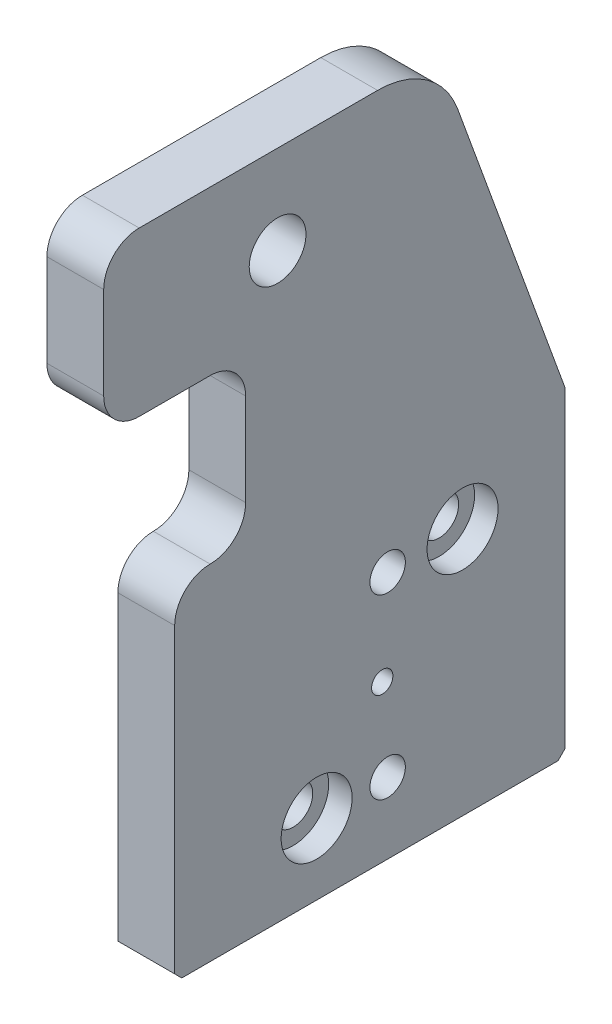
ISO-10303-21;
HEADER;
FILE_DESCRIPTION(('STEP AP214'),'2;1');
FILE_NAME('part.step','',(''),(''),'','','');
FILE_SCHEMA(('AUTOMOTIVE_DESIGN { 1 0 10303 214 1 1 1 1 }'));
ENDSEC;
DATA;
#1=APPLICATION_CONTEXT('core data for automotive mechanical design processes');
#2=APPLICATION_PROTOCOL_DEFINITION('international standard','automotive_design',2000,#1);
#3=PRODUCT_CONTEXT('',#1,'mechanical');
#4=PRODUCT('Part','Part','',(#3));
#5=PRODUCT_RELATED_PRODUCT_CATEGORY('part','',(#4));
#6=PRODUCT_DEFINITION_FORMATION('','',#4);
#7=PRODUCT_DEFINITION_CONTEXT('part definition',#1,'design');
#8=PRODUCT_DEFINITION('design','',#6,#7);
#9=PRODUCT_DEFINITION_SHAPE('','',#8);
#10=(LENGTH_UNIT() NAMED_UNIT(*) SI_UNIT(.MILLI.,.METRE.));
#11=(NAMED_UNIT(*) PLANE_ANGLE_UNIT() SI_UNIT($,.RADIAN.));
#12=(NAMED_UNIT(*) SI_UNIT($,.STERADIAN.) SOLID_ANGLE_UNIT());
#13=UNCERTAINTY_MEASURE_WITH_UNIT(LENGTH_MEASURE(1.E-05),#10,'distance_accuracy_value','');
#14=(GEOMETRIC_REPRESENTATION_CONTEXT(3) GLOBAL_UNCERTAINTY_ASSIGNED_CONTEXT((#13)) GLOBAL_UNIT_ASSIGNED_CONTEXT((#10,
#11,#12)) REPRESENTATION_CONTEXT('',''));
#15=CARTESIAN_POINT('',(0.,0.,0.));
#16=DIRECTION('',(0.,0.,1.));
#17=DIRECTION('',(1.,0.,0.));
#18=AXIS2_PLACEMENT_3D('',#15,#16,#17);
#19=CARTESIAN_POINT('',(8.,0.,-10.));
#20=DIRECTION('',(0.,0.,-1.));
#21=DIRECTION('',(0.,1.,0.));
#22=AXIS2_PLACEMENT_3D('',#19,#20,#21);
#23=PLANE('',#22);
#24=DIRECTION('',(0.,-1.,0.));
#25=VECTOR('',#24,1.);
#26=CARTESIAN_POINT('',(0.,0.,-10.));
#27=LINE('',#26,#25);
#28=CARTESIAN_POINT('',(0.,43.5,-10.));
#29=VERTEX_POINT('',#28);
#30=CARTESIAN_POINT('',(0.,1.,-10.));
#31=VERTEX_POINT('',#30);
#32=EDGE_CURVE('E187',#29,#31,#27,.T.);
#33=ORIENTED_EDGE('',*,*,#32,.T.);
#34=DIRECTION('',(1.,0.,0.));
#35=VECTOR('',#34,1.);
#36=CARTESIAN_POINT('',(8.,1.,-10.));
#37=LINE('',#36,#35);
#38=CARTESIAN_POINT('',(8.,1.,-10.));
#39=VERTEX_POINT('',#38);
#40=EDGE_CURVE('E59',#31,#39,#37,.T.);
#41=ORIENTED_EDGE('',*,*,#40,.T.);
#42=DIRECTION('',(0.,-1.,0.));
#43=VECTOR('',#42,1.);
#44=CARTESIAN_POINT('',(8.,0.,-10.));
#45=LINE('',#44,#43);
#46=CARTESIAN_POINT('',(8.,43.5,-10.));
#47=VERTEX_POINT('',#46);
#48=EDGE_CURVE('E205',#47,#39,#45,.T.);
#49=ORIENTED_EDGE('',*,*,#48,.F.);
#50=DIRECTION('',(-1.,0.,0.));
#51=VECTOR('',#50,1.);
#52=CARTESIAN_POINT('',(8.,43.5,-10.));
#53=LINE('',#52,#51);
#54=EDGE_CURVE('E224',#47,#29,#53,.T.);
#55=ORIENTED_EDGE('',*,*,#54,.T.);
#56=EDGE_LOOP('',(#33,#41,#49,#55));
#57=FACE_BOUND('',#56,.T.);
#58=ADVANCED_FACE('F36',(#57),#23,.F.);
#59=CARTESIAN_POINT('',(8.,0.,0.));
#60=DIRECTION('',(0.,1.,0.));
#61=DIRECTION('',(0.,0.,1.));
#62=AXIS2_PLACEMENT_3D('',#59,#60,#61);
#63=PLANE('',#62);
#64=DIRECTION('',(0.,0.,-1.));
#65=VECTOR('',#64,1.);
#66=CARTESIAN_POINT('',(8.,0.,0.));
#67=LINE('',#66,#65);
#68=CARTESIAN_POINT('',(8.,0.,-11.));
#69=VERTEX_POINT('',#68);
#70=CARTESIAN_POINT('',(8.,0.,-64.));
#71=VERTEX_POINT('',#70);
#72=EDGE_CURVE('E159',#69,#71,#67,.T.);
#73=ORIENTED_EDGE('',*,*,#72,.F.);
#74=DIRECTION('',(-1.,0.,0.));
#75=VECTOR('',#74,1.);
#76=CARTESIAN_POINT('',(8.,0.,-11.));
#77=LINE('',#76,#75);
#78=CARTESIAN_POINT('',(0.,0.,-11.));
#79=VERTEX_POINT('',#78);
#80=EDGE_CURVE('E260',#69,#79,#77,.T.);
#81=ORIENTED_EDGE('',*,*,#80,.T.);
#82=DIRECTION('',(0.,0.,-1.));
#83=VECTOR('',#82,1.);
#84=CARTESIAN_POINT('',(0.,0.,0.));
#85=LINE('',#84,#83);
#86=CARTESIAN_POINT('',(0.,0.,-64.));
#87=VERTEX_POINT('',#86);
#88=EDGE_CURVE('E189',#79,#87,#85,.T.);
#89=ORIENTED_EDGE('',*,*,#88,.T.);
#90=DIRECTION('',(1.,0.,0.));
#91=VECTOR('',#90,1.);
#92=CARTESIAN_POINT('',(8.,0.,-64.));
#93=LINE('',#92,#91);
#94=EDGE_CURVE('E255',#87,#71,#93,.T.);
#95=ORIENTED_EDGE('',*,*,#94,.T.);
#96=EDGE_LOOP('',(#73,#81,#89,#95));
#97=FACE_BOUND('',#96,.T.);
#98=ADVANCED_FACE('F273',(#97),#63,.F.);
#99=CARTESIAN_POINT('',(8.,0.,-65.));
#100=DIRECTION('',(0.,0.,1.));
#101=DIRECTION('',(1.,0.,0.));
#102=AXIS2_PLACEMENT_3D('',#99,#100,#101);
#103=PLANE('',#102);
#104=DIRECTION('',(0.,1.,0.));
#105=VECTOR('',#104,1.);
#106=CARTESIAN_POINT('',(8.,0.,-65.));
#107=LINE('',#106,#105);
#108=CARTESIAN_POINT('',(8.,0.999999999999987,-65.));
#109=VERTEX_POINT('',#108);
#110=CARTESIAN_POINT('',(8.,45.,-65.));
#111=VERTEX_POINT('',#110);
#112=EDGE_CURVE('E150',#109,#111,#107,.T.);
#113=ORIENTED_EDGE('',*,*,#112,.F.);
#114=DIRECTION('',(-1.,0.,0.));
#115=VECTOR('',#114,1.);
#116=CARTESIAN_POINT('',(8.,0.999999999999987,-65.));
#117=LINE('',#116,#115);
#118=CARTESIAN_POINT('',(0.,0.999999999999987,-65.));
#119=VERTEX_POINT('',#118);
#120=EDGE_CURVE('E11',#109,#119,#117,.T.);
#121=ORIENTED_EDGE('',*,*,#120,.T.);
#122=DIRECTION('',(0.,1.,0.));
#123=VECTOR('',#122,1.);
#124=CARTESIAN_POINT('',(0.,0.,-65.));
#125=LINE('',#124,#123);
#126=CARTESIAN_POINT('',(0.,45.,-65.));
#127=VERTEX_POINT('',#126);
#128=EDGE_CURVE('E165',#119,#127,#125,.T.);
#129=ORIENTED_EDGE('',*,*,#128,.T.);
#130=DIRECTION('',(-1.,0.,0.));
#131=VECTOR('',#130,1.);
#132=CARTESIAN_POINT('',(8.,45.,-65.));
#133=LINE('',#132,#131);
#134=EDGE_CURVE('E162',#111,#127,#133,.T.);
#135=ORIENTED_EDGE('',*,*,#134,.F.);
#136=EDGE_LOOP('',(#113,#121,#129,#135));
#137=FACE_BOUND('',#136,.T.);
#138=ADVANCED_FACE('F163',(#137),#103,.F.);
#139=CARTESIAN_POINT('',(8.,26.1545973446358,-71.8591656193139));
#140=DIRECTION('',(0.,-0.342020143325673,0.939692620785907));
#141=DIRECTION('',(0.,-0.939692620785907,-0.342020143325673));
#142=AXIS2_PLACEMENT_3D('',#139,#140,#141);
#143=PLANE('',#142);
#144=DIRECTION('',(0.,0.939692620785907,0.342020143325673));
#145=VECTOR('',#144,1.);
#146=CARTESIAN_POINT('',(0.,26.1545973446358,-71.8591656193139));
#147=LINE('',#146,#145);
#148=CARTESIAN_POINT('',(0.,86.6042417199081,-49.8572943947372));
#149=VERTEX_POINT('',#148);
#150=EDGE_CURVE('E194',#127,#149,#147,.T.);
#151=ORIENTED_EDGE('',*,*,#150,.T.);
#152=DIRECTION('',(-1.,0.,0.));
#153=VECTOR('',#152,1.);
#154=CARTESIAN_POINT('',(8.,86.6042417199081,-49.8572943947372));
#155=LINE('',#154,#153);
#156=CARTESIAN_POINT('',(8.,86.6042417199081,-49.8572943947372));
#157=VERTEX_POINT('',#156);
#158=EDGE_CURVE('E174',#149,#157,#155,.F.);
#159=ORIENTED_EDGE('',*,*,#158,.T.);
#160=DIRECTION('',(0.,0.939692620785907,0.342020143325673));
#161=VECTOR('',#160,1.);
#162=CARTESIAN_POINT('',(8.,26.1545973446358,-71.8591656193139));
#163=LINE('',#162,#161);
#164=EDGE_CURVE('E155',#111,#157,#163,.T.);
#165=ORIENTED_EDGE('',*,*,#164,.F.);
#166=ORIENTED_EDGE('',*,*,#134,.T.);
#167=EDGE_LOOP('',(#151,#159,#165,#166));
#168=FACE_BOUND('',#167,.T.);
#169=ADVANCED_FACE('F172',(#168),#143,.F.);
#170=CARTESIAN_POINT('',(8.,94.5,0.));
#171=DIRECTION('',(0.,1.,0.));
#172=DIRECTION('',(0.,0.,1.));
#173=AXIS2_PLACEMENT_3D('',#170,#171,#172);
#174=PLANE('',#173);
#175=DIRECTION('',(0.,0.,-1.));
#176=VECTOR('',#175,1.);
#177=CARTESIAN_POINT('',(0.,94.5,0.));
#178=LINE('',#177,#176);
#179=CARTESIAN_POINT('',(0.,94.5,-5.));
#180=VERTEX_POINT('',#179);
#181=CARTESIAN_POINT('',(0.,94.5,-38.5809829453063));
#182=VERTEX_POINT('',#181);
#183=EDGE_CURVE('E196',#180,#182,#178,.T.);
#184=ORIENTED_EDGE('',*,*,#183,.F.);
#185=DIRECTION('',(-1.,0.,0.));
#186=VECTOR('',#185,1.);
#187=CARTESIAN_POINT('',(8.,94.5,-5.));
#188=LINE('',#187,#186);
#189=CARTESIAN_POINT('',(8.,94.5,-5.));
#190=VERTEX_POINT('',#189);
#191=EDGE_CURVE('E219',#180,#190,#188,.F.);
#192=ORIENTED_EDGE('',*,*,#191,.T.);
#193=DIRECTION('',(0.,0.,-1.));
#194=VECTOR('',#193,1.);
#195=CARTESIAN_POINT('',(8.,94.5,0.));
#196=LINE('',#195,#194);
#197=CARTESIAN_POINT('',(8.,94.5,-38.5809829453063));
#198=VERTEX_POINT('',#197);
#199=EDGE_CURVE('E175',#190,#198,#196,.T.);
#200=ORIENTED_EDGE('',*,*,#199,.T.);
#201=DIRECTION('',(-1.,0.,0.));
#202=VECTOR('',#201,1.);
#203=CARTESIAN_POINT('',(0.,94.5,-38.5809829453063));
#204=LINE('',#203,#202);
#205=EDGE_CURVE('E169',#198,#182,#204,.T.);
#206=ORIENTED_EDGE('',*,*,#205,.T.);
#207=EDGE_LOOP('',(#184,#192,#200,#206));
#208=FACE_BOUND('',#207,.T.);
#209=ADVANCED_FACE('F321',(#208),#174,.T.);
#210=CARTESIAN_POINT('',(8.,0.,0.));
#211=DIRECTION('',(0.,0.,1.));
#212=DIRECTION('',(1.,0.,0.));
#213=AXIS2_PLACEMENT_3D('',#210,#211,#212);
#214=PLANE('',#213);
#215=DIRECTION('',(0.,1.,0.));
#216=VECTOR('',#215,1.);
#217=CARTESIAN_POINT('',(0.,0.,0.));
#218=LINE('',#217,#216);
#219=CARTESIAN_POINT('',(0.,76.5,0.));
#220=VERTEX_POINT('',#219);
#221=CARTESIAN_POINT('',(0.,89.5,0.));
#222=VERTEX_POINT('',#221);
#223=EDGE_CURVE('E198',#220,#222,#218,.T.);
#224=ORIENTED_EDGE('',*,*,#223,.F.);
#225=DIRECTION('',(-1.,0.,0.));
#226=VECTOR('',#225,1.);
#227=CARTESIAN_POINT('',(8.,76.5,0.));
#228=LINE('',#227,#226);
#229=CARTESIAN_POINT('',(8.,76.5,0.));
#230=VERTEX_POINT('',#229);
#231=EDGE_CURVE('E245',#220,#230,#228,.F.);
#232=ORIENTED_EDGE('',*,*,#231,.T.);
#233=DIRECTION('',(0.,1.,0.));
#234=VECTOR('',#233,1.);
#235=CARTESIAN_POINT('',(8.,0.,0.));
#236=LINE('',#235,#234);
#237=CARTESIAN_POINT('',(8.,89.5,0.));
#238=VERTEX_POINT('',#237);
#239=EDGE_CURVE('E177',#230,#238,#236,.T.);
#240=ORIENTED_EDGE('',*,*,#239,.T.);
#241=DIRECTION('',(-1.,0.,0.));
#242=VECTOR('',#241,1.);
#243=CARTESIAN_POINT('',(8.,89.5,0.));
#244=LINE('',#243,#242);
#245=EDGE_CURVE('E214',#238,#222,#244,.T.);
#246=ORIENTED_EDGE('',*,*,#245,.T.);
#247=EDGE_LOOP('',(#224,#232,#240,#246));
#248=FACE_BOUND('',#247,.T.);
#249=ADVANCED_FACE('F311',(#248),#214,.T.);
#250=CARTESIAN_POINT('',(8.,71.5,0.));
#251=DIRECTION('',(0.,1.,0.));
#252=DIRECTION('',(0.,0.,1.));
#253=AXIS2_PLACEMENT_3D('',#250,#251,#252);
#254=PLANE('',#253);
#255=DIRECTION('',(0.,0.,-1.));
#256=VECTOR('',#255,1.);
#257=CARTESIAN_POINT('',(0.,71.5,0.));
#258=LINE('',#257,#256);
#259=CARTESIAN_POINT('',(0.,71.5,-5.));
#260=VERTEX_POINT('',#259);
#261=CARTESIAN_POINT('',(0.,71.5,-15.));
#262=VERTEX_POINT('',#261);
#263=EDGE_CURVE('E200',#260,#262,#258,.T.);
#264=ORIENTED_EDGE('',*,*,#263,.T.);
#265=DIRECTION('',(-1.,0.,0.));
#266=VECTOR('',#265,1.);
#267=CARTESIAN_POINT('',(8.,71.5,-15.));
#268=LINE('',#267,#266);
#269=CARTESIAN_POINT('',(8.,71.5,-15.));
#270=VERTEX_POINT('',#269);
#271=EDGE_CURVE('E243',#262,#270,#268,.F.);
#272=ORIENTED_EDGE('',*,*,#271,.T.);
#273=DIRECTION('',(0.,0.,-1.));
#274=VECTOR('',#273,1.);
#275=CARTESIAN_POINT('',(8.,71.5,0.));
#276=LINE('',#275,#274);
#277=CARTESIAN_POINT('',(8.,71.5,-5.));
#278=VERTEX_POINT('',#277);
#279=EDGE_CURVE('E182',#278,#270,#276,.T.);
#280=ORIENTED_EDGE('',*,*,#279,.F.);
#281=DIRECTION('',(-1.,0.,0.));
#282=VECTOR('',#281,1.);
#283=CARTESIAN_POINT('',(0.,71.5,-5.));
#284=LINE('',#283,#282);
#285=EDGE_CURVE('E240',#278,#260,#284,.T.);
#286=ORIENTED_EDGE('',*,*,#285,.T.);
#287=EDGE_LOOP('',(#264,#272,#280,#286));
#288=FACE_BOUND('',#287,.T.);
#289=ADVANCED_FACE('F302',(#288),#254,.F.);
#290=CARTESIAN_POINT('',(8.,0.,-20.));
#291=DIRECTION('',(0.,0.,-1.));
#292=DIRECTION('',(0.,1.,0.));
#293=AXIS2_PLACEMENT_3D('',#290,#291,#292);
#294=PLANE('',#293);
#295=DIRECTION('',(0.,-1.,0.));
#296=VECTOR('',#295,1.);
#297=CARTESIAN_POINT('',(0.,0.,-20.));
#298=LINE('',#297,#296);
#299=CARTESIAN_POINT('',(0.,66.5,-20.));
#300=VERTEX_POINT('',#299);
#301=CARTESIAN_POINT('',(0.,53.5,-20.));
#302=VERTEX_POINT('',#301);
#303=EDGE_CURVE('E203',#300,#302,#298,.T.);
#304=ORIENTED_EDGE('',*,*,#303,.T.);
#305=DIRECTION('',(-1.,0.,0.));
#306=VECTOR('',#305,1.);
#307=CARTESIAN_POINT('',(8.,53.5,-20.));
#308=LINE('',#307,#306);
#309=CARTESIAN_POINT('',(8.,53.5,-20.));
#310=VERTEX_POINT('',#309);
#311=EDGE_CURVE('E238',#302,#310,#308,.F.);
#312=ORIENTED_EDGE('',*,*,#311,.T.);
#313=DIRECTION('',(0.,-1.,0.));
#314=VECTOR('',#313,1.);
#315=CARTESIAN_POINT('',(8.,0.,-20.));
#316=LINE('',#315,#314);
#317=CARTESIAN_POINT('',(8.,66.5,-20.));
#318=VERTEX_POINT('',#317);
#319=EDGE_CURVE('E170',#318,#310,#316,.T.);
#320=ORIENTED_EDGE('',*,*,#319,.F.);
#321=DIRECTION('',(-1.,0.,0.));
#322=VECTOR('',#321,1.);
#323=CARTESIAN_POINT('',(0.,66.5,-20.));
#324=LINE('',#323,#322);
#325=EDGE_CURVE('E235',#318,#300,#324,.T.);
#326=ORIENTED_EDGE('',*,*,#325,.T.);
#327=EDGE_LOOP('',(#304,#312,#320,#326));
#328=FACE_BOUND('',#327,.T.);
#329=ADVANCED_FACE('F293',(#328),#294,.F.);
#330=CARTESIAN_POINT('',(8.,0.,0.));
#331=DIRECTION('',(1.,0.,0.));
#332=DIRECTION('',(0.,0.,-1.));
#333=AXIS2_PLACEMENT_3D('',#330,#331,#332);
#334=PLANE('',#333);
#335=CARTESIAN_POINT('',(8.,82.,-24.5));
#336=DIRECTION('',(-1.,0.,0.));
#337=DIRECTION('',(0.,0.,1.));
#338=AXIS2_PLACEMENT_3D('',#335,#336,#337);
#339=CIRCLE('',#338,4.);
#340=CARTESIAN_POINT('',(8.,82.,-20.5));
#341=VERTEX_POINT('',#340);
#342=EDGE_CURVE('E574',#341,#341,#339,.T.);
#343=ORIENTED_EDGE('',*,*,#342,.T.);
#344=EDGE_LOOP('',(#343));
#345=FACE_BOUND('',#344,.T.);
#346=CARTESIAN_POINT('',(8.,35.,-50.5527721213619));
#347=DIRECTION('',(1.,0.,0.));
#348=DIRECTION('',(0.,0.,-1.));
#349=AXIS2_PLACEMENT_3D('',#346,#347,#348);
#350=CIRCLE('',#349,4.99999999999999);
#351=CARTESIAN_POINT('',(8.,35.,-55.5527721213619));
#352=VERTEX_POINT('',#351);
#353=EDGE_CURVE('E579',#352,#352,#350,.T.);
#354=ORIENTED_EDGE('',*,*,#353,.F.);
#355=EDGE_LOOP('',(#354));
#356=FACE_BOUND('',#355,.T.);
#357=CARTESIAN_POINT('',(8.,10.0011135229232,-30.));
#358=DIRECTION('',(1.,0.,0.));
#359=DIRECTION('',(0.,0.,-1.));
#360=AXIS2_PLACEMENT_3D('',#357,#358,#359);
#361=CIRCLE('',#360,4.99999999999999);
#362=CARTESIAN_POINT('',(8.,10.0011135229232,-35.));
#363=VERTEX_POINT('',#362);
#364=EDGE_CURVE('E593',#363,#363,#361,.T.);
#365=ORIENTED_EDGE('',*,*,#364,.F.);
#366=EDGE_LOOP('',(#365));
#367=FACE_BOUND('',#366,.T.);
#368=CARTESIAN_POINT('',(8.,22.,-39.2397015919751));
#369=DIRECTION('',(-1.,0.,0.));
#370=DIRECTION('',(0.,0.,1.));
#371=AXIS2_PLACEMENT_3D('',#368,#369,#370);
#372=CIRCLE('',#371,1.5);
#373=CARTESIAN_POINT('',(8.,22.,-37.7397015919751));
#374=VERTEX_POINT('',#373);
#375=EDGE_CURVE('E608',#374,#374,#372,.T.);
#376=ORIENTED_EDGE('',*,*,#375,.T.);
#377=EDGE_LOOP('',(#376));
#378=FACE_BOUND('',#377,.T.);
#379=CARTESIAN_POINT('',(8.,35.,-40.));
#380=DIRECTION('',(-1.,0.,0.));
#381=DIRECTION('',(0.,0.,1.));
#382=AXIS2_PLACEMENT_3D('',#379,#380,#381);
#383=CIRCLE('',#382,2.5);
#384=CARTESIAN_POINT('',(8.,35.,-37.5));
#385=VERTEX_POINT('',#384);
#386=EDGE_CURVE('E614',#385,#385,#383,.T.);
#387=ORIENTED_EDGE('',*,*,#386,.T.);
#388=EDGE_LOOP('',(#387));
#389=FACE_BOUND('',#388,.T.);
#390=CARTESIAN_POINT('',(8.,10.0011135229232,-40.));
#391=DIRECTION('',(-1.,0.,0.));
#392=DIRECTION('',(0.,0.,1.));
#393=AXIS2_PLACEMENT_3D('',#390,#391,#392);
#394=CIRCLE('',#393,2.5);
#395=CARTESIAN_POINT('',(8.,10.0011135229232,-37.5));
#396=VERTEX_POINT('',#395);
#397=EDGE_CURVE('E258',#396,#396,#394,.T.);
#398=ORIENTED_EDGE('',*,*,#397,.T.);
#399=EDGE_LOOP('',(#398));
#400=FACE_BOUND('',#399,.T.);
#401=ORIENTED_EDGE('',*,*,#48,.T.);
#402=DIRECTION('',(0.,0.707106781186552,0.707106781186543));
#403=VECTOR('',#402,1.);
#404=CARTESIAN_POINT('',(8.,5.49999999999999,-5.50000000000007));
#405=LINE('',#404,#403);
#406=EDGE_CURVE('E44',#39,#69,#405,.F.);
#407=ORIENTED_EDGE('',*,*,#406,.T.);
#408=ORIENTED_EDGE('',*,*,#72,.T.);
#409=DIRECTION('',(0.,-0.707106781186543,0.707106781186552));
#410=VECTOR('',#409,1.);
#411=CARTESIAN_POINT('',(8.,-32.,-31.9999999999996));
#412=LINE('',#411,#410);
#413=EDGE_CURVE('E51',#71,#109,#412,.F.);
#414=ORIENTED_EDGE('',*,*,#413,.T.);
#415=ORIENTED_EDGE('',*,*,#112,.T.);
#416=ORIENTED_EDGE('',*,*,#164,.T.);
#417=CARTESIAN_POINT('',(8.,82.5,-38.5809829453063));
#418=DIRECTION('',(1.,0.,0.));
#419=DIRECTION('',(0.,0.,-1.));
#420=AXIS2_PLACEMENT_3D('',#417,#418,#419);
#421=CIRCLE('',#420,12.);
#422=EDGE_CURVE('E212',#157,#198,#421,.T.);
#423=ORIENTED_EDGE('',*,*,#422,.T.);
#424=ORIENTED_EDGE('',*,*,#199,.F.);
#425=CARTESIAN_POINT('',(8.,89.5,-5.));
#426=DIRECTION('',(1.,0.,0.));
#427=DIRECTION('',(0.,0.,-1.));
#428=AXIS2_PLACEMENT_3D('',#425,#426,#427);
#429=CIRCLE('',#428,5.);
#430=EDGE_CURVE('E221',#190,#238,#429,.T.);
#431=ORIENTED_EDGE('',*,*,#430,.T.);
#432=ORIENTED_EDGE('',*,*,#239,.F.);
#433=CARTESIAN_POINT('',(8.,76.5,-5.));
#434=DIRECTION('',(1.,0.,0.));
#435=DIRECTION('',(0.,0.,-1.));
#436=AXIS2_PLACEMENT_3D('',#433,#434,#435);
#437=CIRCLE('',#436,5.);
#438=EDGE_CURVE('E231',#230,#278,#437,.T.);
#439=ORIENTED_EDGE('',*,*,#438,.T.);
#440=ORIENTED_EDGE('',*,*,#279,.T.);
#441=CARTESIAN_POINT('',(8.,66.5,-15.));
#442=DIRECTION('',(1.,0.,0.));
#443=DIRECTION('',(0.,0.,-1.));
#444=AXIS2_PLACEMENT_3D('',#441,#442,#443);
#445=CIRCLE('',#444,5.);
#446=EDGE_CURVE('E253',#270,#318,#445,.F.);
#447=ORIENTED_EDGE('',*,*,#446,.T.);
#448=ORIENTED_EDGE('',*,*,#319,.T.);
#449=CARTESIAN_POINT('',(8.,53.5,-15.));
#450=DIRECTION('',(1.,0.,0.));
#451=DIRECTION('',(0.,0.,-1.));
#452=AXIS2_PLACEMENT_3D('',#449,#450,#451);
#453=CIRCLE('',#452,5.);
#454=CARTESIAN_POINT('',(8.,48.5,-15.));
#455=VERTEX_POINT('',#454);
#456=EDGE_CURVE('E249',#310,#455,#453,.F.);
#457=ORIENTED_EDGE('',*,*,#456,.T.);
#458=CARTESIAN_POINT('',(8.,43.5,-15.));
#459=DIRECTION('',(1.,0.,0.));
#460=DIRECTION('',(0.,0.,-1.));
#461=AXIS2_PLACEMENT_3D('',#458,#459,#460);
#462=CIRCLE('',#461,5.);
#463=EDGE_CURVE('E233',#455,#47,#462,.T.);
#464=ORIENTED_EDGE('',*,*,#463,.T.);
#465=EDGE_LOOP('',(#401,#407,#408,#414,#415,#416,#423,#424,#431,#432,#439,#440,#447,#448,#457,#464));
#466=FACE_BOUND('',#465,.T.);
#467=ADVANCED_FACE('F152',(#345,#356,#367,#378,#389,#400,#466),#334,.T.);
#468=CARTESIAN_POINT('',(0.,0.,0.));
#469=DIRECTION('',(1.,0.,0.));
#470=DIRECTION('',(0.,0.,-1.));
#471=AXIS2_PLACEMENT_3D('',#468,#469,#470);
#472=PLANE('',#471);
#473=CARTESIAN_POINT('',(0.,82.,-24.5));
#474=DIRECTION('',(-1.,0.,0.));
#475=DIRECTION('',(0.,0.,1.));
#476=AXIS2_PLACEMENT_3D('',#473,#474,#475);
#477=CIRCLE('',#476,4.);
#478=CARTESIAN_POINT('',(0.,82.,-20.5));
#479=VERTEX_POINT('',#478);
#480=EDGE_CURVE('E577',#479,#479,#477,.T.);
#481=ORIENTED_EDGE('',*,*,#480,.F.);
#482=EDGE_LOOP('',(#481));
#483=FACE_BOUND('',#482,.T.);
#484=CARTESIAN_POINT('',(0.,35.,-50.5527721213619));
#485=DIRECTION('',(1.,0.,0.));
#486=DIRECTION('',(0.,0.,-1.));
#487=AXIS2_PLACEMENT_3D('',#484,#485,#486);
#488=CIRCLE('',#487,2.75);
#489=CARTESIAN_POINT('',(0.,35.,-53.3027721213619));
#490=VERTEX_POINT('',#489);
#491=EDGE_CURVE('E590',#490,#490,#488,.T.);
#492=ORIENTED_EDGE('',*,*,#491,.T.);
#493=EDGE_LOOP('',(#492));
#494=FACE_BOUND('',#493,.T.);
#495=CARTESIAN_POINT('',(0.,10.0011135229232,-30.));
#496=DIRECTION('',(1.,0.,0.));
#497=DIRECTION('',(0.,0.,-1.));
#498=AXIS2_PLACEMENT_3D('',#495,#496,#497);
#499=CIRCLE('',#498,2.75);
#500=CARTESIAN_POINT('',(0.,10.0011135229232,-32.75));
#501=VERTEX_POINT('',#500);
#502=EDGE_CURVE('E602',#501,#501,#499,.T.);
#503=ORIENTED_EDGE('',*,*,#502,.T.);
#504=EDGE_LOOP('',(#503));
#505=FACE_BOUND('',#504,.T.);
#506=CARTESIAN_POINT('',(0.,22.,-39.2397015919751));
#507=DIRECTION('',(-1.,0.,0.));
#508=DIRECTION('',(0.,0.,1.));
#509=AXIS2_PLACEMENT_3D('',#506,#507,#508);
#510=CIRCLE('',#509,1.5);
#511=CARTESIAN_POINT('',(0.,22.,-37.7397015919751));
#512=VERTEX_POINT('',#511);
#513=EDGE_CURVE('E605',#512,#512,#510,.T.);
#514=ORIENTED_EDGE('',*,*,#513,.F.);
#515=EDGE_LOOP('',(#514));
#516=FACE_BOUND('',#515,.T.);
#517=CARTESIAN_POINT('',(0.,35.,-40.));
#518=DIRECTION('',(-1.,0.,0.));
#519=DIRECTION('',(0.,0.,1.));
#520=AXIS2_PLACEMENT_3D('',#517,#518,#519);
#521=CIRCLE('',#520,2.49999999999999);
#522=CARTESIAN_POINT('',(0.,35.,-37.5));
#523=VERTEX_POINT('',#522);
#524=EDGE_CURVE('E611',#523,#523,#521,.T.);
#525=ORIENTED_EDGE('',*,*,#524,.F.);
#526=EDGE_LOOP('',(#525));
#527=FACE_BOUND('',#526,.T.);
#528=CARTESIAN_POINT('',(0.,10.0011135229232,-40.));
#529=DIRECTION('',(-1.,0.,0.));
#530=DIRECTION('',(0.,0.,1.));
#531=AXIS2_PLACEMENT_3D('',#528,#529,#530);
#532=CIRCLE('',#531,2.49999999999999);
#533=CARTESIAN_POINT('',(0.,10.0011135229232,-37.5));
#534=VERTEX_POINT('',#533);
#535=EDGE_CURVE('E617',#534,#534,#532,.T.);
#536=ORIENTED_EDGE('',*,*,#535,.F.);
#537=EDGE_LOOP('',(#536));
#538=FACE_BOUND('',#537,.T.);
#539=ORIENTED_EDGE('',*,*,#88,.F.);
#540=DIRECTION('',(0.,-0.707106781186552,-0.707106781186543));
#541=VECTOR('',#540,1.);
#542=CARTESIAN_POINT('',(0.,0.,-11.));
#543=LINE('',#542,#541);
#544=EDGE_CURVE('E265',#79,#31,#543,.F.);
#545=ORIENTED_EDGE('',*,*,#544,.T.);
#546=ORIENTED_EDGE('',*,*,#32,.F.);
#547=CARTESIAN_POINT('',(0.,43.5,-15.));
#548=DIRECTION('',(1.,0.,0.));
#549=DIRECTION('',(0.,0.,-1.));
#550=AXIS2_PLACEMENT_3D('',#547,#548,#549);
#551=CIRCLE('',#550,5.);
#552=CARTESIAN_POINT('',(0.,48.5,-15.));
#553=VERTEX_POINT('',#552);
#554=EDGE_CURVE('E229',#29,#553,#551,.F.);
#555=ORIENTED_EDGE('',*,*,#554,.T.);
#556=CARTESIAN_POINT('',(0.,53.5,-15.));
#557=DIRECTION('',(1.,0.,0.));
#558=DIRECTION('',(0.,0.,-1.));
#559=AXIS2_PLACEMENT_3D('',#556,#557,#558);
#560=CIRCLE('',#559,5.);
#561=EDGE_CURVE('E247',#553,#302,#560,.T.);
#562=ORIENTED_EDGE('',*,*,#561,.T.);
#563=ORIENTED_EDGE('',*,*,#303,.F.);
#564=CARTESIAN_POINT('',(0.,66.5,-15.));
#565=DIRECTION('',(1.,0.,0.));
#566=DIRECTION('',(0.,0.,-1.));
#567=AXIS2_PLACEMENT_3D('',#564,#565,#566);
#568=CIRCLE('',#567,5.);
#569=EDGE_CURVE('E251',#300,#262,#568,.T.);
#570=ORIENTED_EDGE('',*,*,#569,.T.);
#571=ORIENTED_EDGE('',*,*,#263,.F.);
#572=CARTESIAN_POINT('',(0.,76.5,-5.));
#573=DIRECTION('',(1.,0.,0.));
#574=DIRECTION('',(0.,0.,-1.));
#575=AXIS2_PLACEMENT_3D('',#572,#573,#574);
#576=CIRCLE('',#575,5.);
#577=EDGE_CURVE('E227',#260,#220,#576,.F.);
#578=ORIENTED_EDGE('',*,*,#577,.T.);
#579=ORIENTED_EDGE('',*,*,#223,.T.);
#580=CARTESIAN_POINT('',(0.,89.5,-5.));
#581=DIRECTION('',(1.,0.,0.));
#582=DIRECTION('',(0.,0.,-1.));
#583=AXIS2_PLACEMENT_3D('',#580,#581,#582);
#584=CIRCLE('',#583,5.);
#585=EDGE_CURVE('E217',#222,#180,#584,.F.);
#586=ORIENTED_EDGE('',*,*,#585,.T.);
#587=ORIENTED_EDGE('',*,*,#183,.T.);
#588=CARTESIAN_POINT('',(0.,82.5,-38.5809829453063));
#589=DIRECTION('',(1.,0.,0.));
#590=DIRECTION('',(0.,0.,-1.));
#591=AXIS2_PLACEMENT_3D('',#588,#589,#590);
#592=CIRCLE('',#591,12.);
#593=EDGE_CURVE('E209',#182,#149,#592,.F.);
#594=ORIENTED_EDGE('',*,*,#593,.T.);
#595=ORIENTED_EDGE('',*,*,#150,.F.);
#596=ORIENTED_EDGE('',*,*,#128,.F.);
#597=DIRECTION('',(0.,0.707106781186543,-0.707106781186552));
#598=VECTOR('',#597,1.);
#599=CARTESIAN_POINT('',(0.,0.999999999999987,-65.));
#600=LINE('',#599,#598);
#601=EDGE_CURVE('E263',#119,#87,#600,.F.);
#602=ORIENTED_EDGE('',*,*,#601,.T.);
#603=EDGE_LOOP('',(#539,#545,#546,#555,#562,#563,#570,#571,#578,#579,#586,#587,#594,#595,#596,#602));
#604=FACE_BOUND('',#603,.T.);
#605=ADVANCED_FACE('F279',(#483,#494,#505,#516,#527,#538,#604),#472,.F.);
#606=CARTESIAN_POINT('',(8.,82.5,-38.5809829453063));
#607=DIRECTION('',(1.,0.,0.));
#608=DIRECTION('',(0.,0.,-1.));
#609=AXIS2_PLACEMENT_3D('',#606,#607,#608);
#610=CYLINDRICAL_SURFACE('',#609,12.);
#611=ORIENTED_EDGE('',*,*,#422,.F.);
#612=ORIENTED_EDGE('',*,*,#158,.F.);
#613=ORIENTED_EDGE('',*,*,#593,.F.);
#614=ORIENTED_EDGE('',*,*,#205,.F.);
#615=EDGE_LOOP('',(#611,#612,#613,#614));
#616=FACE_BOUND('',#615,.T.);
#617=ADVANCED_FACE('F325',(#616),#610,.T.);
#618=CARTESIAN_POINT('',(8.,89.5,-5.));
#619=DIRECTION('',(-1.,0.,0.));
#620=DIRECTION('',(0.,0.,1.));
#621=AXIS2_PLACEMENT_3D('',#618,#619,#620);
#622=CYLINDRICAL_SURFACE('',#621,5.);
#623=ORIENTED_EDGE('',*,*,#430,.F.);
#624=ORIENTED_EDGE('',*,*,#191,.F.);
#625=ORIENTED_EDGE('',*,*,#585,.F.);
#626=ORIENTED_EDGE('',*,*,#245,.F.);
#627=EDGE_LOOP('',(#623,#624,#625,#626));
#628=FACE_BOUND('',#627,.T.);
#629=ADVANCED_FACE('F316',(#628),#622,.T.);
#630=CARTESIAN_POINT('',(8.,53.5,-15.));
#631=DIRECTION('',(1.,0.,0.));
#632=DIRECTION('',(0.,0.,-1.));
#633=AXIS2_PLACEMENT_3D('',#630,#631,#632);
#634=CYLINDRICAL_SURFACE('',#633,5.);
#635=DIRECTION('',(-1.,0.,0.));
#636=VECTOR('',#635,1.);
#637=CARTESIAN_POINT('',(0.,48.5,-15.));
#638=LINE('',#637,#636);
#639=EDGE_CURVE('E190',#455,#553,#638,.T.);
#640=ORIENTED_EDGE('',*,*,#639,.F.);
#641=ORIENTED_EDGE('',*,*,#456,.F.);
#642=ORIENTED_EDGE('',*,*,#311,.F.);
#643=ORIENTED_EDGE('',*,*,#561,.F.);
#644=EDGE_LOOP('',(#640,#641,#642,#643));
#645=FACE_BOUND('',#644,.T.);
#646=ADVANCED_FACE('F289',(#645),#634,.F.);
#647=CARTESIAN_POINT('',(8.,43.5,-15.));
#648=DIRECTION('',(-1.,0.,0.));
#649=DIRECTION('',(0.,0.,1.));
#650=AXIS2_PLACEMENT_3D('',#647,#648,#649);
#651=CYLINDRICAL_SURFACE('',#650,5.);
#652=ORIENTED_EDGE('',*,*,#463,.F.);
#653=ORIENTED_EDGE('',*,*,#639,.T.);
#654=ORIENTED_EDGE('',*,*,#554,.F.);
#655=ORIENTED_EDGE('',*,*,#54,.F.);
#656=EDGE_LOOP('',(#652,#653,#654,#655));
#657=FACE_BOUND('',#656,.T.);
#658=ADVANCED_FACE('F283',(#657),#651,.T.);
#659=CARTESIAN_POINT('',(8.,66.5,-15.));
#660=DIRECTION('',(1.,0.,0.));
#661=DIRECTION('',(0.,0.,-1.));
#662=AXIS2_PLACEMENT_3D('',#659,#660,#661);
#663=CYLINDRICAL_SURFACE('',#662,5.);
#664=ORIENTED_EDGE('',*,*,#446,.F.);
#665=ORIENTED_EDGE('',*,*,#271,.F.);
#666=ORIENTED_EDGE('',*,*,#569,.F.);
#667=ORIENTED_EDGE('',*,*,#325,.F.);
#668=EDGE_LOOP('',(#664,#665,#666,#667));
#669=FACE_BOUND('',#668,.T.);
#670=ADVANCED_FACE('F299',(#669),#663,.F.);
#671=CARTESIAN_POINT('',(8.,76.5,-5.));
#672=DIRECTION('',(1.,0.,0.));
#673=DIRECTION('',(0.,0.,-1.));
#674=AXIS2_PLACEMENT_3D('',#671,#672,#673);
#675=CYLINDRICAL_SURFACE('',#674,5.);
#676=ORIENTED_EDGE('',*,*,#438,.F.);
#677=ORIENTED_EDGE('',*,*,#231,.F.);
#678=ORIENTED_EDGE('',*,*,#577,.F.);
#679=ORIENTED_EDGE('',*,*,#285,.F.);
#680=EDGE_LOOP('',(#676,#677,#678,#679));
#681=FACE_BOUND('',#680,.T.);
#682=ADVANCED_FACE('F306',(#681),#675,.T.);
#683=CARTESIAN_POINT('',(8.,0.,-11.));
#684=DIRECTION('',(0.,0.707106781186543,-0.707106781186552));
#685=DIRECTION('',(-1.,0.,0.));
#686=AXIS2_PLACEMENT_3D('',#683,#684,#685);
#687=PLANE('',#686);
#688=ORIENTED_EDGE('',*,*,#406,.F.);
#689=ORIENTED_EDGE('',*,*,#40,.F.);
#690=ORIENTED_EDGE('',*,*,#544,.F.);
#691=ORIENTED_EDGE('',*,*,#80,.F.);
#692=EDGE_LOOP('',(#688,#689,#690,#691));
#693=FACE_BOUND('',#692,.T.);
#694=ADVANCED_FACE('F276',(#693),#687,.F.);
#695=CARTESIAN_POINT('',(8.,0.999999999999987,-65.));
#696=DIRECTION('',(0.,0.707106781186552,0.707106781186543));
#697=DIRECTION('',(-1.,0.,0.));
#698=AXIS2_PLACEMENT_3D('',#695,#696,#697);
#699=PLANE('',#698);
#700=ORIENTED_EDGE('',*,*,#413,.F.);
#701=ORIENTED_EDGE('',*,*,#94,.F.);
#702=ORIENTED_EDGE('',*,*,#601,.F.);
#703=ORIENTED_EDGE('',*,*,#120,.F.);
#704=EDGE_LOOP('',(#700,#701,#702,#703));
#705=FACE_BOUND('',#704,.T.);
#706=ADVANCED_FACE('F38',(#705),#699,.F.);
#707=CARTESIAN_POINT('',(0.,10.0011135229232,-40.));
#708=DIRECTION('',(-1.,0.,0.));
#709=DIRECTION('',(0.,0.,1.));
#710=AXIS2_PLACEMENT_3D('',#707,#708,#709);
#711=CYLINDRICAL_SURFACE('',#710,2.49999999999999);
#712=ORIENTED_EDGE('',*,*,#397,.F.);
#713=EDGE_LOOP('',(#712));
#714=FACE_BOUND('',#713,.T.);
#715=ORIENTED_EDGE('',*,*,#535,.T.);
#716=EDGE_LOOP('',(#715));
#717=FACE_BOUND('',#716,.T.);
#718=ADVANCED_FACE('F328',(#714,#717),#711,.F.);
#719=CARTESIAN_POINT('',(0.,35.,-40.));
#720=DIRECTION('',(-1.,0.,0.));
#721=DIRECTION('',(0.,0.,1.));
#722=AXIS2_PLACEMENT_3D('',#719,#720,#721);
#723=CYLINDRICAL_SURFACE('',#722,2.49999999999999);
#724=ORIENTED_EDGE('',*,*,#386,.F.);
#725=EDGE_LOOP('',(#724));
#726=FACE_BOUND('',#725,.T.);
#727=ORIENTED_EDGE('',*,*,#524,.T.);
#728=EDGE_LOOP('',(#727));
#729=FACE_BOUND('',#728,.T.);
#730=ADVANCED_FACE('F333',(#726,#729),#723,.F.);
#731=CARTESIAN_POINT('',(0.,22.,-39.2397015919751));
#732=DIRECTION('',(-1.,0.,0.));
#733=DIRECTION('',(0.,0.,1.));
#734=AXIS2_PLACEMENT_3D('',#731,#732,#733);
#735=CYLINDRICAL_SURFACE('',#734,1.5);
#736=ORIENTED_EDGE('',*,*,#375,.F.);
#737=EDGE_LOOP('',(#736));
#738=FACE_BOUND('',#737,.T.);
#739=ORIENTED_EDGE('',*,*,#513,.T.);
#740=EDGE_LOOP('',(#739));
#741=FACE_BOUND('',#740,.T.);
#742=ADVANCED_FACE('F387',(#738,#741),#735,.F.);
#743=CARTESIAN_POINT('',(8.,10.0011135229232,-30.));
#744=DIRECTION('',(1.,0.,0.));
#745=DIRECTION('',(0.,0.,-1.));
#746=AXIS2_PLACEMENT_3D('',#743,#744,#745);
#747=CYLINDRICAL_SURFACE('',#746,2.75);
#748=ORIENTED_EDGE('',*,*,#502,.F.);
#749=EDGE_LOOP('',(#748));
#750=FACE_BOUND('',#749,.T.);
#751=CARTESIAN_POINT('',(4.7,10.0011135229232,-30.));
#752=DIRECTION('',(1.,0.,0.));
#753=DIRECTION('',(0.,0.,-1.));
#754=AXIS2_PLACEMENT_3D('',#751,#752,#753);
#755=CIRCLE('',#754,2.75000000000001);
#756=CARTESIAN_POINT('',(4.7,10.0011135229232,-32.75));
#757=VERTEX_POINT('',#756);
#758=EDGE_CURVE('E599',#757,#757,#755,.T.);
#759=ORIENTED_EDGE('',*,*,#758,.T.);
#760=EDGE_LOOP('',(#759));
#761=FACE_BOUND('',#760,.T.);
#762=ADVANCED_FACE('F397',(#750,#761),#747,.F.);
#763=CARTESIAN_POINT('',(4.7,12.7511135229232,-30.));
#764=DIRECTION('',(-1.,0.,0.));
#765=DIRECTION('',(0.,0.,1.));
#766=AXIS2_PLACEMENT_3D('',#763,#764,#765);
#767=PLANE('',#766);
#768=ORIENTED_EDGE('',*,*,#758,.F.);
#769=EDGE_LOOP('',(#768));
#770=FACE_BOUND('',#769,.T.);
#771=CARTESIAN_POINT('',(4.7,10.0011135229232,-30.));
#772=DIRECTION('',(1.,0.,0.));
#773=DIRECTION('',(0.,0.,-1.));
#774=AXIS2_PLACEMENT_3D('',#771,#772,#773);
#775=CIRCLE('',#774,4.99999999999999);
#776=CARTESIAN_POINT('',(4.7,10.0011135229232,-35.));
#777=VERTEX_POINT('',#776);
#778=EDGE_CURVE('E596',#777,#777,#775,.T.);
#779=ORIENTED_EDGE('',*,*,#778,.T.);
#780=EDGE_LOOP('',(#779));
#781=FACE_BOUND('',#780,.T.);
#782=ADVANCED_FACE('F407',(#770,#781),#767,.F.);
#783=CARTESIAN_POINT('',(8.,10.0011135229232,-30.));
#784=DIRECTION('',(1.,0.,0.));
#785=DIRECTION('',(0.,0.,-1.));
#786=AXIS2_PLACEMENT_3D('',#783,#784,#785);
#787=CYLINDRICAL_SURFACE('',#786,4.99999999999999);
#788=ORIENTED_EDGE('',*,*,#778,.F.);
#789=EDGE_LOOP('',(#788));
#790=FACE_BOUND('',#789,.T.);
#791=ORIENTED_EDGE('',*,*,#364,.T.);
#792=EDGE_LOOP('',(#791));
#793=FACE_BOUND('',#792,.T.);
#794=ADVANCED_FACE('F417',(#790,#793),#787,.F.);
#795=CARTESIAN_POINT('',(8.,35.,-50.5527721213619));
#796=DIRECTION('',(1.,0.,0.));
#797=DIRECTION('',(0.,0.,-1.));
#798=AXIS2_PLACEMENT_3D('',#795,#796,#797);
#799=CYLINDRICAL_SURFACE('',#798,2.75);
#800=ORIENTED_EDGE('',*,*,#491,.F.);
#801=EDGE_LOOP('',(#800));
#802=FACE_BOUND('',#801,.T.);
#803=CARTESIAN_POINT('',(4.7,35.,-50.5527721213619));
#804=DIRECTION('',(1.,0.,0.));
#805=DIRECTION('',(0.,0.,-1.));
#806=AXIS2_PLACEMENT_3D('',#803,#804,#805);
#807=CIRCLE('',#806,2.75000000000001);
#808=CARTESIAN_POINT('',(4.7,35.,-53.3027721213619));
#809=VERTEX_POINT('',#808);
#810=EDGE_CURVE('E587',#809,#809,#807,.T.);
#811=ORIENTED_EDGE('',*,*,#810,.T.);
#812=EDGE_LOOP('',(#811));
#813=FACE_BOUND('',#812,.T.);
#814=ADVANCED_FACE('F427',(#802,#813),#799,.F.);
#815=CARTESIAN_POINT('',(4.7,37.75,-50.5527721213619));
#816=DIRECTION('',(-1.,0.,0.));
#817=DIRECTION('',(0.,0.,1.));
#818=AXIS2_PLACEMENT_3D('',#815,#816,#817);
#819=PLANE('',#818);
#820=ORIENTED_EDGE('',*,*,#810,.F.);
#821=EDGE_LOOP('',(#820));
#822=FACE_BOUND('',#821,.T.);
#823=CARTESIAN_POINT('',(4.7,35.,-50.5527721213619));
#824=DIRECTION('',(1.,0.,0.));
#825=DIRECTION('',(0.,0.,-1.));
#826=AXIS2_PLACEMENT_3D('',#823,#824,#825);
#827=CIRCLE('',#826,4.99999999999999);
#828=CARTESIAN_POINT('',(4.7,35.,-55.5527721213619));
#829=VERTEX_POINT('',#828);
#830=EDGE_CURVE('E584',#829,#829,#827,.T.);
#831=ORIENTED_EDGE('',*,*,#830,.T.);
#832=EDGE_LOOP('',(#831));
#833=FACE_BOUND('',#832,.T.);
#834=ADVANCED_FACE('F437',(#822,#833),#819,.F.);
#835=CARTESIAN_POINT('',(8.,35.,-50.5527721213619));
#836=DIRECTION('',(1.,0.,0.));
#837=DIRECTION('',(0.,0.,-1.));
#838=AXIS2_PLACEMENT_3D('',#835,#836,#837);
#839=CYLINDRICAL_SURFACE('',#838,4.99999999999999);
#840=ORIENTED_EDGE('',*,*,#830,.F.);
#841=EDGE_LOOP('',(#840));
#842=FACE_BOUND('',#841,.T.);
#843=ORIENTED_EDGE('',*,*,#353,.T.);
#844=EDGE_LOOP('',(#843));
#845=FACE_BOUND('',#844,.T.);
#846=ADVANCED_FACE('F447',(#842,#845),#839,.F.);
#847=CARTESIAN_POINT('',(0.,82.,-24.5));
#848=DIRECTION('',(-1.,0.,0.));
#849=DIRECTION('',(0.,0.,1.));
#850=AXIS2_PLACEMENT_3D('',#847,#848,#849);
#851=CYLINDRICAL_SURFACE('',#850,4.);
#852=ORIENTED_EDGE('',*,*,#342,.F.);
#853=EDGE_LOOP('',(#852));
#854=FACE_BOUND('',#853,.T.);
#855=ORIENTED_EDGE('',*,*,#480,.T.);
#856=EDGE_LOOP('',(#855));
#857=FACE_BOUND('',#856,.T.);
#858=ADVANCED_FACE('F457',(#854,#857),#851,.F.);
#859=CLOSED_SHELL('',(#58,#98,#138,#169,#209,#249,#289,#329,#467,#605,#617,#629,#646,#658,#670,
#682,#694,#706,#718,#730,#742,#762,#782,#794,#814,#834,#846,#858));
#860=MANIFOLD_SOLID_BREP('B2',#859);
#861=ADVANCED_BREP_SHAPE_REPRESENTATION('',(#18,#860),#14);
#862=SHAPE_DEFINITION_REPRESENTATION(#9,#861);
ENDSEC;
END-ISO-10303-21;
